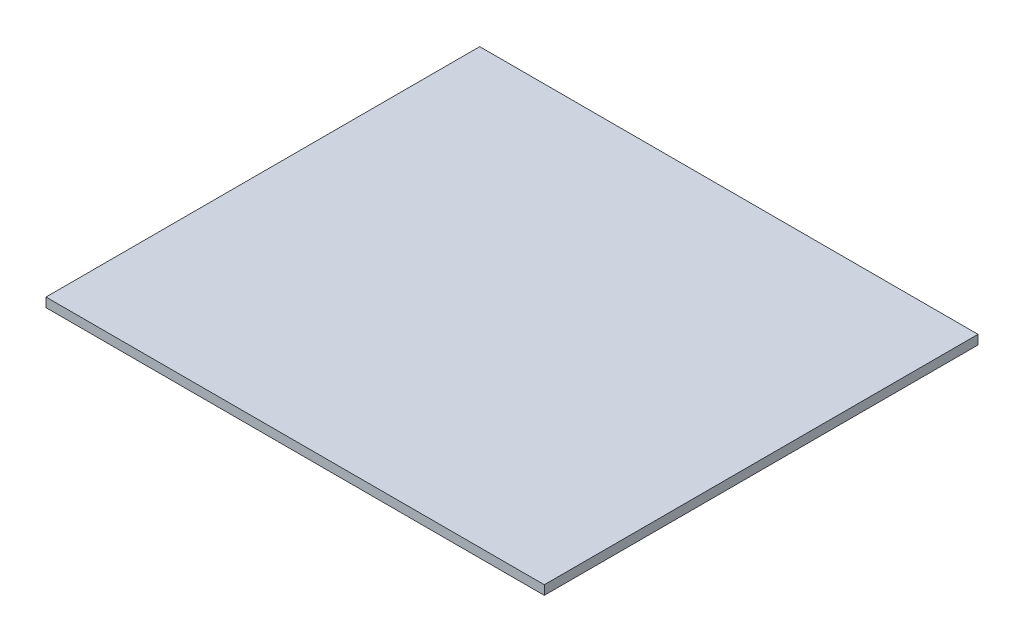
ISO-10303-21;
HEADER;
FILE_DESCRIPTION(('STEP AP214'),'2;1');
FILE_NAME('part.step','',(''),(''),'','','');
FILE_SCHEMA(('AUTOMOTIVE_DESIGN { 1 0 10303 214 1 1 1 1 }'));
ENDSEC;
DATA;
#1=APPLICATION_CONTEXT('core data for automotive mechanical design processes');
#2=APPLICATION_PROTOCOL_DEFINITION('international standard','automotive_design',2000,#1);
#3=PRODUCT_CONTEXT('',#1,'mechanical');
#4=PRODUCT('Part','Part','',(#3));
#5=PRODUCT_RELATED_PRODUCT_CATEGORY('part','',(#4));
#6=PRODUCT_DEFINITION_FORMATION('','',#4);
#7=PRODUCT_DEFINITION_CONTEXT('part definition',#1,'design');
#8=PRODUCT_DEFINITION('design','',#6,#7);
#9=PRODUCT_DEFINITION_SHAPE('','',#8);
#10=(LENGTH_UNIT() NAMED_UNIT(*) SI_UNIT(.MILLI.,.METRE.));
#11=(NAMED_UNIT(*) PLANE_ANGLE_UNIT() SI_UNIT($,.RADIAN.));
#12=(NAMED_UNIT(*) SI_UNIT($,.STERADIAN.) SOLID_ANGLE_UNIT());
#13=UNCERTAINTY_MEASURE_WITH_UNIT(LENGTH_MEASURE(1.E-05),#10,'distance_accuracy_value','');
#14=(GEOMETRIC_REPRESENTATION_CONTEXT(3) GLOBAL_UNCERTAINTY_ASSIGNED_CONTEXT((#13)) GLOBAL_UNIT_ASSIGNED_CONTEXT((#10,
#11,#12)) REPRESENTATION_CONTEXT('',''));
#15=CARTESIAN_POINT('',(0.,0.,0.));
#16=DIRECTION('',(0.,0.,1.));
#17=DIRECTION('',(1.,0.,0.));
#18=AXIS2_PLACEMENT_3D('',#15,#16,#17);
#19=CARTESIAN_POINT('',(135.,5.,-117.5));
#20=DIRECTION('',(-1.,0.,0.));
#21=DIRECTION('',(0.,0.,1.));
#22=AXIS2_PLACEMENT_3D('',#19,#20,#21);
#23=PLANE('',#22);
#24=DIRECTION('',(0.,0.,-1.));
#25=VECTOR('',#24,1.);
#26=CARTESIAN_POINT('',(135.,0.,-117.5));
#27=LINE('',#26,#25);
#28=CARTESIAN_POINT('',(135.,0.,117.5));
#29=VERTEX_POINT('',#28);
#30=CARTESIAN_POINT('',(135.,0.,-117.5));
#31=VERTEX_POINT('',#30);
#32=EDGE_CURVE('E96',#29,#31,#27,.T.);
#33=ORIENTED_EDGE('',*,*,#32,.T.);
#34=DIRECTION('',(0.,-1.,0.));
#35=VECTOR('',#34,1.);
#36=CARTESIAN_POINT('',(135.,5.,-117.5));
#37=LINE('',#36,#35);
#38=CARTESIAN_POINT('',(135.,5.,-117.5));
#39=VERTEX_POINT('',#38);
#40=EDGE_CURVE('E11',#39,#31,#37,.T.);
#41=ORIENTED_EDGE('',*,*,#40,.F.);
#42=DIRECTION('',(0.,0.,-1.));
#43=VECTOR('',#42,1.);
#44=CARTESIAN_POINT('',(135.,5.,-117.5));
#45=LINE('',#44,#43);
#46=CARTESIAN_POINT('',(135.,5.,117.5));
#47=VERTEX_POINT('',#46);
#48=EDGE_CURVE('E84',#47,#39,#45,.T.);
#49=ORIENTED_EDGE('',*,*,#48,.F.);
#50=DIRECTION('',(0.,-1.,0.));
#51=VECTOR('',#50,1.);
#52=CARTESIAN_POINT('',(135.,5.,117.5));
#53=LINE('',#52,#51);
#54=EDGE_CURVE('E92',#47,#29,#53,.T.);
#55=ORIENTED_EDGE('',*,*,#54,.T.);
#56=EDGE_LOOP('',(#33,#41,#49,#55));
#57=FACE_BOUND('',#56,.T.);
#58=ADVANCED_FACE('F33',(#57),#23,.F.);
#59=CARTESIAN_POINT('',(-135.,5.,-117.5));
#60=DIRECTION('',(0.,0.,1.));
#61=DIRECTION('',(1.,0.,0.));
#62=AXIS2_PLACEMENT_3D('',#59,#60,#61);
#63=PLANE('',#62);
#64=DIRECTION('',(-1.,0.,0.));
#65=VECTOR('',#64,1.);
#66=CARTESIAN_POINT('',(-135.,0.,-117.5));
#67=LINE('',#66,#65);
#68=CARTESIAN_POINT('',(-135.,0.,-117.5));
#69=VERTEX_POINT('',#68);
#70=EDGE_CURVE('E88',#31,#69,#67,.T.);
#71=ORIENTED_EDGE('',*,*,#70,.T.);
#72=DIRECTION('',(0.,-1.,0.));
#73=VECTOR('',#72,1.);
#74=CARTESIAN_POINT('',(-135.,5.,-117.5));
#75=LINE('',#74,#73);
#76=CARTESIAN_POINT('',(-135.,5.,-117.5));
#77=VERTEX_POINT('',#76);
#78=EDGE_CURVE('E41',#77,#69,#75,.T.);
#79=ORIENTED_EDGE('',*,*,#78,.F.);
#80=DIRECTION('',(-1.,0.,0.));
#81=VECTOR('',#80,1.);
#82=CARTESIAN_POINT('',(-135.,5.,-117.5));
#83=LINE('',#82,#81);
#84=EDGE_CURVE('E79',#39,#77,#83,.T.);
#85=ORIENTED_EDGE('',*,*,#84,.F.);
#86=ORIENTED_EDGE('',*,*,#40,.T.);
#87=EDGE_LOOP('',(#71,#79,#85,#86));
#88=FACE_BOUND('',#87,.T.);
#89=ADVANCED_FACE('F87',(#88),#63,.F.);
#90=CARTESIAN_POINT('',(-135.,5.,-117.5));
#91=DIRECTION('',(1.,0.,0.));
#92=DIRECTION('',(0.,0.,-1.));
#93=AXIS2_PLACEMENT_3D('',#90,#91,#92);
#94=PLANE('',#93);
#95=DIRECTION('',(0.,0.,1.));
#96=VECTOR('',#95,1.);
#97=CARTESIAN_POINT('',(-135.,0.,-117.5));
#98=LINE('',#97,#96);
#99=CARTESIAN_POINT('',(-135.,0.,117.5));
#100=VERTEX_POINT('',#99);
#101=EDGE_CURVE('E66',#69,#100,#98,.T.);
#102=ORIENTED_EDGE('',*,*,#101,.T.);
#103=DIRECTION('',(0.,-1.,0.));
#104=VECTOR('',#103,1.);
#105=CARTESIAN_POINT('',(-135.,5.,117.5));
#106=LINE('',#105,#104);
#107=CARTESIAN_POINT('',(-135.,5.,117.5));
#108=VERTEX_POINT('',#107);
#109=EDGE_CURVE('E89',#108,#100,#106,.T.);
#110=ORIENTED_EDGE('',*,*,#109,.F.);
#111=DIRECTION('',(0.,0.,1.));
#112=VECTOR('',#111,1.);
#113=CARTESIAN_POINT('',(-135.,5.,-117.5));
#114=LINE('',#113,#112);
#115=EDGE_CURVE('E82',#77,#108,#114,.T.);
#116=ORIENTED_EDGE('',*,*,#115,.F.);
#117=ORIENTED_EDGE('',*,*,#78,.T.);
#118=EDGE_LOOP('',(#102,#110,#116,#117));
#119=FACE_BOUND('',#118,.T.);
#120=ADVANCED_FACE('F90',(#119),#94,.F.);
#121=CARTESIAN_POINT('',(-135.,5.,117.5));
#122=DIRECTION('',(0.,0.,-1.));
#123=DIRECTION('',(-1.,0.,0.));
#124=AXIS2_PLACEMENT_3D('',#121,#122,#123);
#125=PLANE('',#124);
#126=DIRECTION('',(1.,0.,0.));
#127=VECTOR('',#126,1.);
#128=CARTESIAN_POINT('',(-135.,0.,117.5));
#129=LINE('',#128,#127);
#130=EDGE_CURVE('E72',#100,#29,#129,.T.);
#131=ORIENTED_EDGE('',*,*,#130,.T.);
#132=ORIENTED_EDGE('',*,*,#54,.F.);
#133=DIRECTION('',(1.,0.,0.));
#134=VECTOR('',#133,1.);
#135=CARTESIAN_POINT('',(-135.,5.,117.5));
#136=LINE('',#135,#134);
#137=EDGE_CURVE('E49',#108,#47,#136,.T.);
#138=ORIENTED_EDGE('',*,*,#137,.F.);
#139=ORIENTED_EDGE('',*,*,#109,.T.);
#140=EDGE_LOOP('',(#131,#132,#138,#139));
#141=FACE_BOUND('',#140,.T.);
#142=ADVANCED_FACE('F103',(#141),#125,.F.);
#143=CARTESIAN_POINT('',(0.,5.,0.));
#144=DIRECTION('',(0.,1.,0.));
#145=DIRECTION('',(0.,0.,1.));
#146=AXIS2_PLACEMENT_3D('',#143,#144,#145);
#147=PLANE('',#146);
#148=ORIENTED_EDGE('',*,*,#48,.T.);
#149=ORIENTED_EDGE('',*,*,#84,.T.);
#150=ORIENTED_EDGE('',*,*,#115,.T.);
#151=ORIENTED_EDGE('',*,*,#137,.T.);
#152=EDGE_LOOP('',(#148,#149,#150,#151));
#153=FACE_BOUND('',#152,.T.);
#154=ADVANCED_FACE('F80',(#153),#147,.T.);
#155=CARTESIAN_POINT('',(0.,0.,0.));
#156=DIRECTION('',(0.,1.,0.));
#157=DIRECTION('',(0.,0.,1.));
#158=AXIS2_PLACEMENT_3D('',#155,#156,#157);
#159=PLANE('',#158);
#160=ORIENTED_EDGE('',*,*,#32,.F.);
#161=ORIENTED_EDGE('',*,*,#130,.F.);
#162=ORIENTED_EDGE('',*,*,#101,.F.);
#163=ORIENTED_EDGE('',*,*,#70,.F.);
#164=EDGE_LOOP('',(#160,#161,#162,#163));
#165=FACE_BOUND('',#164,.T.);
#166=ADVANCED_FACE('F106',(#165),#159,.F.);
#167=CLOSED_SHELL('',(#58,#89,#120,#142,#154,#166));
#168=MANIFOLD_SOLID_BREP('B2',#167);
#169=ADVANCED_BREP_SHAPE_REPRESENTATION('',(#18,#168),#14);
#170=SHAPE_DEFINITION_REPRESENTATION(#9,#169);
ENDSEC;
END-ISO-10303-21;
